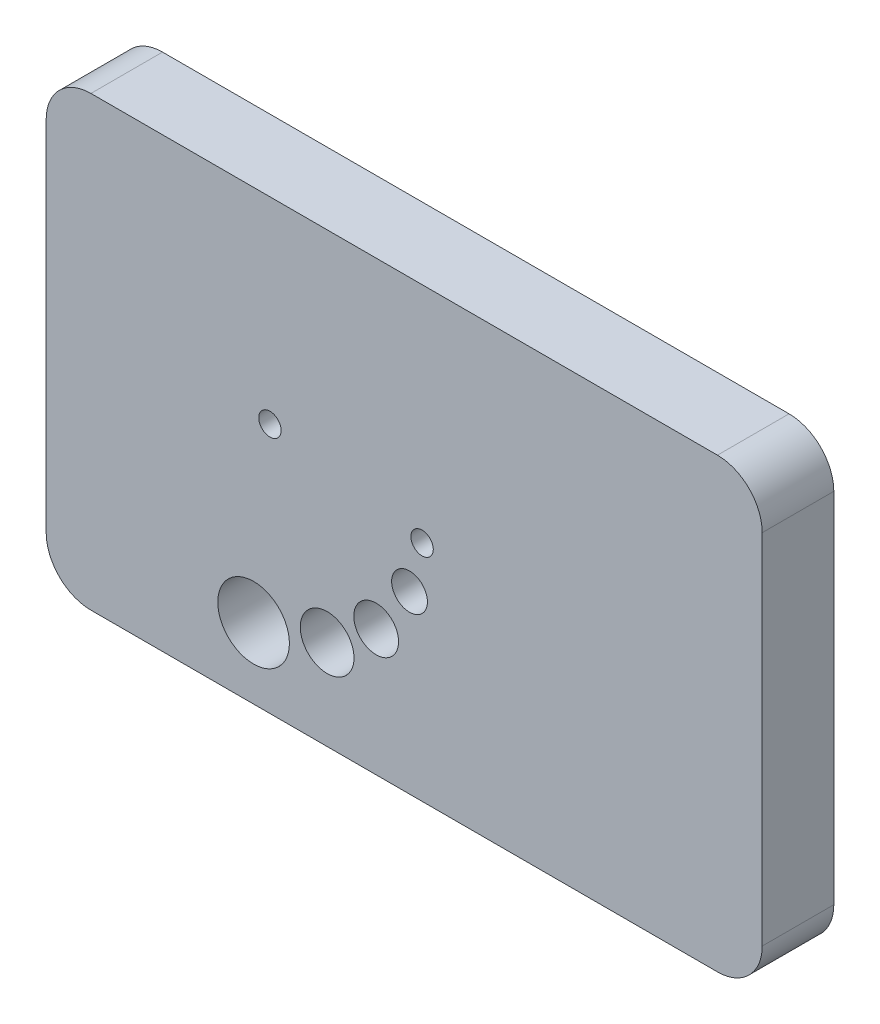
ISO-10303-21;
HEADER;
FILE_DESCRIPTION(('STEP AP214'),'2;1');
FILE_NAME('part.step','',(''),(''),'','','');
FILE_SCHEMA(('AUTOMOTIVE_DESIGN { 1 0 10303 214 1 1 1 1 }'));
ENDSEC;
DATA;
#1=APPLICATION_CONTEXT('core data for automotive mechanical design processes');
#2=APPLICATION_PROTOCOL_DEFINITION('international standard','automotive_design',2000,#1);
#3=PRODUCT_CONTEXT('',#1,'mechanical');
#4=PRODUCT('Part','Part','',(#3));
#5=PRODUCT_RELATED_PRODUCT_CATEGORY('part','',(#4));
#6=PRODUCT_DEFINITION_FORMATION('','',#4);
#7=PRODUCT_DEFINITION_CONTEXT('part definition',#1,'design');
#8=PRODUCT_DEFINITION('design','',#6,#7);
#9=PRODUCT_DEFINITION_SHAPE('','',#8);
#10=(LENGTH_UNIT() NAMED_UNIT(*) SI_UNIT(.MILLI.,.METRE.));
#11=(NAMED_UNIT(*) PLANE_ANGLE_UNIT() SI_UNIT($,.RADIAN.));
#12=(NAMED_UNIT(*) SI_UNIT($,.STERADIAN.) SOLID_ANGLE_UNIT());
#13=UNCERTAINTY_MEASURE_WITH_UNIT(LENGTH_MEASURE(1.E-05),#10,'distance_accuracy_value','');
#14=(GEOMETRIC_REPRESENTATION_CONTEXT(3) GLOBAL_UNCERTAINTY_ASSIGNED_CONTEXT((#13)) GLOBAL_UNIT_ASSIGNED_CONTEXT((#10,
#11,#12)) REPRESENTATION_CONTEXT('',''));
#15=CARTESIAN_POINT('',(0.,0.,0.));
#16=DIRECTION('',(0.,0.,1.));
#17=DIRECTION('',(1.,0.,0.));
#18=AXIS2_PLACEMENT_3D('',#15,#16,#17);
#19=CARTESIAN_POINT('',(0.,0.,8.));
#20=DIRECTION('',(0.,0.,-1.));
#21=DIRECTION('',(-1.,0.,0.));
#22=AXIS2_PLACEMENT_3D('',#19,#20,#21);
#23=PLANE('',#22);
#24=DIRECTION('',(-1.,0.,0.));
#25=VECTOR('',#24,1.);
#26=CARTESIAN_POINT('',(0.,50.,8.));
#27=LINE('',#26,#25);
#28=CARTESIAN_POINT('',(75.,50.,8.));
#29=VERTEX_POINT('',#28);
#30=CARTESIAN_POINT('',(5.,50.,8.));
#31=VERTEX_POINT('',#30);
#32=EDGE_CURVE('E136',#29,#31,#27,.T.);
#33=ORIENTED_EDGE('',*,*,#32,.T.);
#34=CARTESIAN_POINT('',(5.,45.,8.));
#35=DIRECTION('',(0.,0.,-1.));
#36=DIRECTION('',(-1.,0.,0.));
#37=AXIS2_PLACEMENT_3D('',#34,#35,#36);
#38=CIRCLE('',#37,5.);
#39=CARTESIAN_POINT('',(0.,45.,8.));
#40=VERTEX_POINT('',#39);
#41=EDGE_CURVE('E155',#31,#40,#38,.F.);
#42=ORIENTED_EDGE('',*,*,#41,.T.);
#43=DIRECTION('',(0.,-1.,0.));
#44=VECTOR('',#43,1.);
#45=CARTESIAN_POINT('',(0.,0.,8.));
#46=LINE('',#45,#44);
#47=CARTESIAN_POINT('',(0.,5.,8.));
#48=VERTEX_POINT('',#47);
#49=EDGE_CURVE('E119',#40,#48,#46,.T.);
#50=ORIENTED_EDGE('',*,*,#49,.T.);
#51=CARTESIAN_POINT('',(5.,5.,8.));
#52=DIRECTION('',(0.,0.,-1.));
#53=DIRECTION('',(-1.,0.,0.));
#54=AXIS2_PLACEMENT_3D('',#51,#52,#53);
#55=CIRCLE('',#54,5.);
#56=CARTESIAN_POINT('',(5.,0.,8.));
#57=VERTEX_POINT('',#56);
#58=EDGE_CURVE('E150',#48,#57,#55,.F.);
#59=ORIENTED_EDGE('',*,*,#58,.T.);
#60=DIRECTION('',(1.,0.,0.));
#61=VECTOR('',#60,1.);
#62=CARTESIAN_POINT('',(0.,0.,8.));
#63=LINE('',#62,#61);
#64=CARTESIAN_POINT('',(75.,0.,8.));
#65=VERTEX_POINT('',#64);
#66=EDGE_CURVE('E166',#57,#65,#63,.T.);
#67=ORIENTED_EDGE('',*,*,#66,.T.);
#68=CARTESIAN_POINT('',(75.,5.,8.));
#69=DIRECTION('',(0.,0.,-1.));
#70=DIRECTION('',(-1.,0.,0.));
#71=AXIS2_PLACEMENT_3D('',#68,#69,#70);
#72=CIRCLE('',#71,5.);
#73=CARTESIAN_POINT('',(80.,5.,8.));
#74=VERTEX_POINT('',#73);
#75=EDGE_CURVE('E55',#65,#74,#72,.F.);
#76=ORIENTED_EDGE('',*,*,#75,.T.);
#77=DIRECTION('',(0.,1.,0.));
#78=VECTOR('',#77,1.);
#79=CARTESIAN_POINT('',(80.,0.,8.));
#80=LINE('',#79,#78);
#81=CARTESIAN_POINT('',(80.,45.,8.));
#82=VERTEX_POINT('',#81);
#83=EDGE_CURVE('E174',#74,#82,#80,.T.);
#84=ORIENTED_EDGE('',*,*,#83,.T.);
#85=CARTESIAN_POINT('',(75.,45.,8.));
#86=DIRECTION('',(0.,0.,-1.));
#87=DIRECTION('',(-1.,0.,0.));
#88=AXIS2_PLACEMENT_3D('',#85,#86,#87);
#89=CIRCLE('',#88,5.);
#90=EDGE_CURVE('E153',#82,#29,#89,.F.);
#91=ORIENTED_EDGE('',*,*,#90,.T.);
#92=EDGE_LOOP('',(#33,#42,#50,#59,#67,#76,#84,#91));
#93=FACE_BOUND('',#92,.T.);
#94=CARTESIAN_POINT('',(25.,28.,8.));
#95=DIRECTION('',(0.,0.,1.));
#96=DIRECTION('',(1.,0.,0.));
#97=AXIS2_PLACEMENT_3D('',#94,#95,#96);
#98=CIRCLE('',#97,1.25);
#99=CARTESIAN_POINT('',(26.25,28.,8.));
#100=VERTEX_POINT('',#99);
#101=EDGE_CURVE('E127',#100,#100,#98,.T.);
#102=ORIENTED_EDGE('',*,*,#101,.F.);
#103=EDGE_LOOP('',(#102));
#104=FACE_BOUND('',#103,.T.);
#105=CARTESIAN_POINT('',(42.,25.,8.));
#106=DIRECTION('',(0.,0.,1.));
#107=DIRECTION('',(1.,0.,0.));
#108=AXIS2_PLACEMENT_3D('',#105,#106,#107);
#109=CIRCLE('',#108,1.25);
#110=CARTESIAN_POINT('',(43.25,25.,8.));
#111=VERTEX_POINT('',#110);
#112=EDGE_CURVE('E181',#111,#111,#109,.T.);
#113=ORIENTED_EDGE('',*,*,#112,.F.);
#114=EDGE_LOOP('',(#113));
#115=FACE_BOUND('',#114,.T.);
#116=CARTESIAN_POINT('',(40.5955116125583,19.598395279367,8.));
#117=DIRECTION('',(0.,0.,1.));
#118=DIRECTION('',(1.,0.,0.));
#119=AXIS2_PLACEMENT_3D('',#116,#117,#118);
#120=CIRCLE('',#119,2.);
#121=CARTESIAN_POINT('',(42.5955116125583,19.598395279367,8.));
#122=VERTEX_POINT('',#121);
#123=EDGE_CURVE('E186',#122,#122,#120,.T.);
#124=ORIENTED_EDGE('',*,*,#123,.F.);
#125=EDGE_LOOP('',(#124));
#126=FACE_BOUND('',#125,.T.);
#127=CARTESIAN_POINT('',(36.8701085414122,14.1198613512111,8.));
#128=DIRECTION('',(0.,0.,1.));
#129=DIRECTION('',(1.,0.,0.));
#130=AXIS2_PLACEMENT_3D('',#127,#128,#129);
#131=CIRCLE('',#130,2.5);
#132=CARTESIAN_POINT('',(39.3701085414122,14.1198613512111,8.));
#133=VERTEX_POINT('',#132);
#134=EDGE_CURVE('E192',#133,#133,#131,.T.);
#135=ORIENTED_EDGE('',*,*,#134,.F.);
#136=EDGE_LOOP('',(#135));
#137=FACE_BOUND('',#136,.T.);
#138=CARTESIAN_POINT('',(31.3915746132563,10.0657462443757,8.));
#139=DIRECTION('',(0.,0.,1.));
#140=DIRECTION('',(1.,0.,0.));
#141=AXIS2_PLACEMENT_3D('',#138,#139,#140);
#142=CIRCLE('',#141,3.);
#143=CARTESIAN_POINT('',(34.3915746132563,10.0657462443757,8.));
#144=VERTEX_POINT('',#143);
#145=EDGE_CURVE('E198',#144,#144,#142,.T.);
#146=ORIENTED_EDGE('',*,*,#145,.F.);
#147=EDGE_LOOP('',(#146));
#148=FACE_BOUND('',#147,.T.);
#149=CARTESIAN_POINT('',(23.1737737210224,7.87433267311331,8.));
#150=DIRECTION('',(0.,0.,1.));
#151=DIRECTION('',(1.,0.,0.));
#152=AXIS2_PLACEMENT_3D('',#149,#150,#151);
#153=CIRCLE('',#152,4.);
#154=CARTESIAN_POINT('',(27.1737737210224,7.87433267311331,8.));
#155=VERTEX_POINT('',#154);
#156=EDGE_CURVE('E204',#155,#155,#153,.T.);
#157=ORIENTED_EDGE('',*,*,#156,.F.);
#158=EDGE_LOOP('',(#157));
#159=FACE_BOUND('',#158,.T.);
#160=ADVANCED_FACE('F33',(#93,#104,#115,#126,#137,#148,#159),#23,.F.);
#161=CARTESIAN_POINT('',(0.,0.,0.));
#162=DIRECTION('',(0.,0.,-1.));
#163=DIRECTION('',(-1.,0.,0.));
#164=AXIS2_PLACEMENT_3D('',#161,#162,#163);
#165=PLANE('',#164);
#166=CARTESIAN_POINT('',(31.3915746132563,10.0657462443757,0.));
#167=DIRECTION('',(0.,0.,1.));
#168=DIRECTION('',(1.,0.,0.));
#169=AXIS2_PLACEMENT_3D('',#166,#167,#168);
#170=CIRCLE('',#169,3.);
#171=CARTESIAN_POINT('',(34.3915746132563,10.0657462443757,0.));
#172=VERTEX_POINT('',#171);
#173=EDGE_CURVE('E201',#172,#172,#170,.T.);
#174=ORIENTED_EDGE('',*,*,#173,.T.);
#175=EDGE_LOOP('',(#174));
#176=FACE_BOUND('',#175,.T.);
#177=CARTESIAN_POINT('',(40.5955116125583,19.598395279367,0.));
#178=DIRECTION('',(0.,0.,1.));
#179=DIRECTION('',(1.,0.,0.));
#180=AXIS2_PLACEMENT_3D('',#177,#178,#179);
#181=CIRCLE('',#180,2.);
#182=CARTESIAN_POINT('',(42.5955116125583,19.598395279367,0.));
#183=VERTEX_POINT('',#182);
#184=EDGE_CURVE('E189',#183,#183,#181,.T.);
#185=ORIENTED_EDGE('',*,*,#184,.T.);
#186=EDGE_LOOP('',(#185));
#187=FACE_BOUND('',#186,.T.);
#188=CARTESIAN_POINT('',(25.,28.,0.));
#189=DIRECTION('',(0.,0.,1.));
#190=DIRECTION('',(1.,0.,0.));
#191=AXIS2_PLACEMENT_3D('',#188,#189,#190);
#192=CIRCLE('',#191,1.25);
#193=CARTESIAN_POINT('',(26.25,28.,0.));
#194=VERTEX_POINT('',#193);
#195=EDGE_CURVE('E133',#194,#194,#192,.T.);
#196=ORIENTED_EDGE('',*,*,#195,.T.);
#197=EDGE_LOOP('',(#196));
#198=FACE_BOUND('',#197,.T.);
#199=DIRECTION('',(0.,-1.,0.));
#200=VECTOR('',#199,1.);
#201=CARTESIAN_POINT('',(0.,0.,0.));
#202=LINE('',#201,#200);
#203=CARTESIAN_POINT('',(0.,45.,0.));
#204=VERTEX_POINT('',#203);
#205=CARTESIAN_POINT('',(0.,5.,0.));
#206=VERTEX_POINT('',#205);
#207=EDGE_CURVE('E116',#204,#206,#202,.T.);
#208=ORIENTED_EDGE('',*,*,#207,.F.);
#209=CARTESIAN_POINT('',(5.,45.,0.));
#210=DIRECTION('',(0.,0.,-1.));
#211=DIRECTION('',(-1.,0.,0.));
#212=AXIS2_PLACEMENT_3D('',#209,#210,#211);
#213=CIRCLE('',#212,5.);
#214=CARTESIAN_POINT('',(5.,50.,0.));
#215=VERTEX_POINT('',#214);
#216=EDGE_CURVE('E99',#204,#215,#213,.T.);
#217=ORIENTED_EDGE('',*,*,#216,.T.);
#218=DIRECTION('',(-1.,0.,0.));
#219=VECTOR('',#218,1.);
#220=CARTESIAN_POINT('',(0.,50.,0.));
#221=LINE('',#220,#219);
#222=CARTESIAN_POINT('',(75.,50.,0.));
#223=VERTEX_POINT('',#222);
#224=EDGE_CURVE('E140',#223,#215,#221,.T.);
#225=ORIENTED_EDGE('',*,*,#224,.F.);
#226=CARTESIAN_POINT('',(75.,45.,0.));
#227=DIRECTION('',(0.,0.,-1.));
#228=DIRECTION('',(-1.,0.,0.));
#229=AXIS2_PLACEMENT_3D('',#226,#227,#228);
#230=CIRCLE('',#229,5.);
#231=CARTESIAN_POINT('',(80.,45.,0.));
#232=VERTEX_POINT('',#231);
#233=EDGE_CURVE('E110',#223,#232,#230,.T.);
#234=ORIENTED_EDGE('',*,*,#233,.T.);
#235=DIRECTION('',(0.,1.,0.));
#236=VECTOR('',#235,1.);
#237=CARTESIAN_POINT('',(80.,0.,0.));
#238=LINE('',#237,#236);
#239=CARTESIAN_POINT('',(80.,5.,0.));
#240=VERTEX_POINT('',#239);
#241=EDGE_CURVE('E130',#240,#232,#238,.T.);
#242=ORIENTED_EDGE('',*,*,#241,.F.);
#243=CARTESIAN_POINT('',(75.,5.,0.));
#244=DIRECTION('',(0.,0.,-1.));
#245=DIRECTION('',(-1.,0.,0.));
#246=AXIS2_PLACEMENT_3D('',#243,#244,#245);
#247=CIRCLE('',#246,5.);
#248=CARTESIAN_POINT('',(75.,0.,0.));
#249=VERTEX_POINT('',#248);
#250=EDGE_CURVE('E144',#240,#249,#247,.T.);
#251=ORIENTED_EDGE('',*,*,#250,.T.);
#252=DIRECTION('',(1.,0.,0.));
#253=VECTOR('',#252,1.);
#254=CARTESIAN_POINT('',(0.,0.,0.));
#255=LINE('',#254,#253);
#256=CARTESIAN_POINT('',(5.,0.,0.));
#257=VERTEX_POINT('',#256);
#258=EDGE_CURVE('E126',#257,#249,#255,.T.);
#259=ORIENTED_EDGE('',*,*,#258,.F.);
#260=CARTESIAN_POINT('',(5.,5.,0.));
#261=DIRECTION('',(0.,0.,-1.));
#262=DIRECTION('',(-1.,0.,0.));
#263=AXIS2_PLACEMENT_3D('',#260,#261,#262);
#264=CIRCLE('',#263,5.);
#265=EDGE_CURVE('E120',#257,#206,#264,.T.);
#266=ORIENTED_EDGE('',*,*,#265,.T.);
#267=EDGE_LOOP('',(#208,#217,#225,#234,#242,#251,#259,#266));
#268=FACE_BOUND('',#267,.T.);
#269=CARTESIAN_POINT('',(42.,25.,0.));
#270=DIRECTION('',(0.,0.,1.));
#271=DIRECTION('',(1.,0.,0.));
#272=AXIS2_PLACEMENT_3D('',#269,#270,#271);
#273=CIRCLE('',#272,1.25);
#274=CARTESIAN_POINT('',(43.25,25.,0.));
#275=VERTEX_POINT('',#274);
#276=EDGE_CURVE('E183',#275,#275,#273,.T.);
#277=ORIENTED_EDGE('',*,*,#276,.T.);
#278=EDGE_LOOP('',(#277));
#279=FACE_BOUND('',#278,.T.);
#280=CARTESIAN_POINT('',(36.8701085414122,14.1198613512111,0.));
#281=DIRECTION('',(0.,0.,1.));
#282=DIRECTION('',(1.,0.,0.));
#283=AXIS2_PLACEMENT_3D('',#280,#281,#282);
#284=CIRCLE('',#283,2.5);
#285=CARTESIAN_POINT('',(39.3701085414122,14.1198613512111,0.));
#286=VERTEX_POINT('',#285);
#287=EDGE_CURVE('E195',#286,#286,#284,.T.);
#288=ORIENTED_EDGE('',*,*,#287,.T.);
#289=EDGE_LOOP('',(#288));
#290=FACE_BOUND('',#289,.T.);
#291=CARTESIAN_POINT('',(23.1737737210224,7.87433267311331,0.));
#292=DIRECTION('',(0.,0.,1.));
#293=DIRECTION('',(1.,0.,0.));
#294=AXIS2_PLACEMENT_3D('',#291,#292,#293);
#295=CIRCLE('',#294,4.);
#296=CARTESIAN_POINT('',(27.1737737210224,7.87433267311331,0.));
#297=VERTEX_POINT('',#296);
#298=EDGE_CURVE('E207',#297,#297,#295,.T.);
#299=ORIENTED_EDGE('',*,*,#298,.T.);
#300=EDGE_LOOP('',(#299));
#301=FACE_BOUND('',#300,.T.);
#302=ADVANCED_FACE('F123',(#176,#187,#198,#268,#279,#290,#301),#165,.T.);
#303=CARTESIAN_POINT('',(0.,0.,8.));
#304=DIRECTION('',(1.,0.,0.));
#305=DIRECTION('',(0.,0.,-1.));
#306=AXIS2_PLACEMENT_3D('',#303,#304,#305);
#307=PLANE('',#306);
#308=ORIENTED_EDGE('',*,*,#49,.F.);
#309=DIRECTION('',(0.,0.,-1.));
#310=VECTOR('',#309,1.);
#311=CARTESIAN_POINT('',(0.,45.,8.));
#312=LINE('',#311,#310);
#313=EDGE_CURVE('E103',#40,#204,#312,.T.);
#314=ORIENTED_EDGE('',*,*,#313,.T.);
#315=ORIENTED_EDGE('',*,*,#207,.T.);
#316=DIRECTION('',(0.,0.,-1.));
#317=VECTOR('',#316,1.);
#318=CARTESIAN_POINT('',(0.,5.,8.));
#319=LINE('',#318,#317);
#320=EDGE_CURVE('E121',#206,#48,#319,.F.);
#321=ORIENTED_EDGE('',*,*,#320,.T.);
#322=EDGE_LOOP('',(#308,#314,#315,#321));
#323=FACE_BOUND('',#322,.T.);
#324=ADVANCED_FACE('F115',(#323),#307,.F.);
#325=CARTESIAN_POINT('',(0.,0.,8.));
#326=DIRECTION('',(0.,1.,0.));
#327=DIRECTION('',(0.,0.,1.));
#328=AXIS2_PLACEMENT_3D('',#325,#326,#327);
#329=PLANE('',#328);
#330=ORIENTED_EDGE('',*,*,#258,.T.);
#331=DIRECTION('',(0.,0.,-1.));
#332=VECTOR('',#331,1.);
#333=CARTESIAN_POINT('',(75.,0.,8.));
#334=LINE('',#333,#332);
#335=EDGE_CURVE('E11',#249,#65,#334,.F.);
#336=ORIENTED_EDGE('',*,*,#335,.T.);
#337=ORIENTED_EDGE('',*,*,#66,.F.);
#338=DIRECTION('',(0.,0.,-1.));
#339=VECTOR('',#338,1.);
#340=CARTESIAN_POINT('',(5.,0.,8.));
#341=LINE('',#340,#339);
#342=EDGE_CURVE('E41',#57,#257,#341,.T.);
#343=ORIENTED_EDGE('',*,*,#342,.T.);
#344=EDGE_LOOP('',(#330,#336,#337,#343));
#345=FACE_BOUND('',#344,.T.);
#346=ADVANCED_FACE('F164',(#345),#329,.F.);
#347=CARTESIAN_POINT('',(80.,0.,8.));
#348=DIRECTION('',(-1.,0.,0.));
#349=DIRECTION('',(0.,0.,1.));
#350=AXIS2_PLACEMENT_3D('',#347,#348,#349);
#351=PLANE('',#350);
#352=ORIENTED_EDGE('',*,*,#241,.T.);
#353=DIRECTION('',(0.,0.,-1.));
#354=VECTOR('',#353,1.);
#355=CARTESIAN_POINT('',(80.,45.,8.));
#356=LINE('',#355,#354);
#357=EDGE_CURVE('E48',#232,#82,#356,.F.);
#358=ORIENTED_EDGE('',*,*,#357,.T.);
#359=ORIENTED_EDGE('',*,*,#83,.F.);
#360=DIRECTION('',(0.,0.,-1.));
#361=VECTOR('',#360,1.);
#362=CARTESIAN_POINT('',(80.,5.,8.));
#363=LINE('',#362,#361);
#364=EDGE_CURVE('E157',#74,#240,#363,.T.);
#365=ORIENTED_EDGE('',*,*,#364,.T.);
#366=EDGE_LOOP('',(#352,#358,#359,#365));
#367=FACE_BOUND('',#366,.T.);
#368=ADVANCED_FACE('F173',(#367),#351,.F.);
#369=CARTESIAN_POINT('',(0.,50.,8.));
#370=DIRECTION('',(0.,-1.,0.));
#371=DIRECTION('',(0.,0.,-1.));
#372=AXIS2_PLACEMENT_3D('',#369,#370,#371);
#373=PLANE('',#372);
#374=ORIENTED_EDGE('',*,*,#224,.T.);
#375=DIRECTION('',(0.,0.,-1.));
#376=VECTOR('',#375,1.);
#377=CARTESIAN_POINT('',(5.,50.,8.));
#378=LINE('',#377,#376);
#379=EDGE_CURVE('E104',#215,#31,#378,.F.);
#380=ORIENTED_EDGE('',*,*,#379,.T.);
#381=ORIENTED_EDGE('',*,*,#32,.F.);
#382=DIRECTION('',(0.,0.,-1.));
#383=VECTOR('',#382,1.);
#384=CARTESIAN_POINT('',(75.,50.,8.));
#385=LINE('',#384,#383);
#386=EDGE_CURVE('E109',#29,#223,#385,.T.);
#387=ORIENTED_EDGE('',*,*,#386,.T.);
#388=EDGE_LOOP('',(#374,#380,#381,#387));
#389=FACE_BOUND('',#388,.T.);
#390=ADVANCED_FACE('F228',(#389),#373,.F.);
#391=CARTESIAN_POINT('',(25.,28.,8.));
#392=DIRECTION('',(0.,0.,-1.));
#393=DIRECTION('',(-1.,0.,0.));
#394=AXIS2_PLACEMENT_3D('',#391,#392,#393);
#395=CYLINDRICAL_SURFACE('',#394,1.25);
#396=ORIENTED_EDGE('',*,*,#101,.T.);
#397=EDGE_LOOP('',(#396));
#398=FACE_BOUND('',#397,.T.);
#399=ORIENTED_EDGE('',*,*,#195,.F.);
#400=EDGE_LOOP('',(#399));
#401=FACE_BOUND('',#400,.T.);
#402=ADVANCED_FACE('F225',(#398,#401),#395,.F.);
#403=CARTESIAN_POINT('',(42.,25.,8.));
#404=DIRECTION('',(0.,0.,-1.));
#405=DIRECTION('',(-1.,0.,0.));
#406=AXIS2_PLACEMENT_3D('',#403,#404,#405);
#407=CYLINDRICAL_SURFACE('',#406,1.25);
#408=ORIENTED_EDGE('',*,*,#112,.T.);
#409=EDGE_LOOP('',(#408));
#410=FACE_BOUND('',#409,.T.);
#411=ORIENTED_EDGE('',*,*,#276,.F.);
#412=EDGE_LOOP('',(#411));
#413=FACE_BOUND('',#412,.T.);
#414=ADVANCED_FACE('F341',(#410,#413),#407,.F.);
#415=CARTESIAN_POINT('',(40.5955116125583,19.598395279367,8.));
#416=DIRECTION('',(0.,0.,-1.));
#417=DIRECTION('',(-1.,0.,0.));
#418=AXIS2_PLACEMENT_3D('',#415,#416,#417);
#419=CYLINDRICAL_SURFACE('',#418,2.);
#420=ORIENTED_EDGE('',*,*,#123,.T.);
#421=EDGE_LOOP('',(#420));
#422=FACE_BOUND('',#421,.T.);
#423=ORIENTED_EDGE('',*,*,#184,.F.);
#424=EDGE_LOOP('',(#423));
#425=FACE_BOUND('',#424,.T.);
#426=ADVANCED_FACE('F331',(#422,#425),#419,.F.);
#427=CARTESIAN_POINT('',(36.8701085414122,14.1198613512111,8.));
#428=DIRECTION('',(0.,0.,-1.));
#429=DIRECTION('',(-1.,0.,0.));
#430=AXIS2_PLACEMENT_3D('',#427,#428,#429);
#431=CYLINDRICAL_SURFACE('',#430,2.5);
#432=ORIENTED_EDGE('',*,*,#134,.T.);
#433=EDGE_LOOP('',(#432));
#434=FACE_BOUND('',#433,.T.);
#435=ORIENTED_EDGE('',*,*,#287,.F.);
#436=EDGE_LOOP('',(#435));
#437=FACE_BOUND('',#436,.T.);
#438=ADVANCED_FACE('F321',(#434,#437),#431,.F.);
#439=CARTESIAN_POINT('',(31.3915746132563,10.0657462443757,8.));
#440=DIRECTION('',(0.,0.,-1.));
#441=DIRECTION('',(-1.,0.,0.));
#442=AXIS2_PLACEMENT_3D('',#439,#440,#441);
#443=CYLINDRICAL_SURFACE('',#442,3.);
#444=ORIENTED_EDGE('',*,*,#145,.T.);
#445=EDGE_LOOP('',(#444));
#446=FACE_BOUND('',#445,.T.);
#447=ORIENTED_EDGE('',*,*,#173,.F.);
#448=EDGE_LOOP('',(#447));
#449=FACE_BOUND('',#448,.T.);
#450=ADVANCED_FACE('F312',(#446,#449),#443,.F.);
#451=CARTESIAN_POINT('',(23.1737737210224,7.87433267311331,8.));
#452=DIRECTION('',(0.,0.,-1.));
#453=DIRECTION('',(-1.,0.,0.));
#454=AXIS2_PLACEMENT_3D('',#451,#452,#453);
#455=CYLINDRICAL_SURFACE('',#454,4.);
#456=ORIENTED_EDGE('',*,*,#156,.T.);
#457=EDGE_LOOP('',(#456));
#458=FACE_BOUND('',#457,.T.);
#459=ORIENTED_EDGE('',*,*,#298,.F.);
#460=EDGE_LOOP('',(#459));
#461=FACE_BOUND('',#460,.T.);
#462=ADVANCED_FACE('F213',(#458,#461),#455,.F.);
#463=CARTESIAN_POINT('',(5.,45.,8.));
#464=DIRECTION('',(0.,0.,-1.));
#465=DIRECTION('',(-1.,0.,0.));
#466=AXIS2_PLACEMENT_3D('',#463,#464,#465);
#467=CYLINDRICAL_SURFACE('',#466,5.);
#468=ORIENTED_EDGE('',*,*,#41,.F.);
#469=ORIENTED_EDGE('',*,*,#379,.F.);
#470=ORIENTED_EDGE('',*,*,#216,.F.);
#471=ORIENTED_EDGE('',*,*,#313,.F.);
#472=EDGE_LOOP('',(#468,#469,#470,#471));
#473=FACE_BOUND('',#472,.T.);
#474=ADVANCED_FACE('F102',(#473),#467,.T.);
#475=CARTESIAN_POINT('',(75.,45.,8.));
#476=DIRECTION('',(0.,0.,-1.));
#477=DIRECTION('',(-1.,0.,0.));
#478=AXIS2_PLACEMENT_3D('',#475,#476,#477);
#479=CYLINDRICAL_SURFACE('',#478,5.);
#480=ORIENTED_EDGE('',*,*,#90,.F.);
#481=ORIENTED_EDGE('',*,*,#357,.F.);
#482=ORIENTED_EDGE('',*,*,#233,.F.);
#483=ORIENTED_EDGE('',*,*,#386,.F.);
#484=EDGE_LOOP('',(#480,#481,#482,#483));
#485=FACE_BOUND('',#484,.T.);
#486=ADVANCED_FACE('F240',(#485),#479,.T.);
#487=CARTESIAN_POINT('',(75.,5.,8.));
#488=DIRECTION('',(0.,0.,-1.));
#489=DIRECTION('',(-1.,0.,0.));
#490=AXIS2_PLACEMENT_3D('',#487,#488,#489);
#491=CYLINDRICAL_SURFACE('',#490,5.);
#492=ORIENTED_EDGE('',*,*,#75,.F.);
#493=ORIENTED_EDGE('',*,*,#335,.F.);
#494=ORIENTED_EDGE('',*,*,#250,.F.);
#495=ORIENTED_EDGE('',*,*,#364,.F.);
#496=EDGE_LOOP('',(#492,#493,#494,#495));
#497=FACE_BOUND('',#496,.T.);
#498=ADVANCED_FACE('F172',(#497),#491,.T.);
#499=CARTESIAN_POINT('',(5.,5.,8.));
#500=DIRECTION('',(0.,0.,-1.));
#501=DIRECTION('',(-1.,0.,0.));
#502=AXIS2_PLACEMENT_3D('',#499,#500,#501);
#503=CYLINDRICAL_SURFACE('',#502,5.);
#504=ORIENTED_EDGE('',*,*,#58,.F.);
#505=ORIENTED_EDGE('',*,*,#320,.F.);
#506=ORIENTED_EDGE('',*,*,#265,.F.);
#507=ORIENTED_EDGE('',*,*,#342,.F.);
#508=EDGE_LOOP('',(#504,#505,#506,#507));
#509=FACE_BOUND('',#508,.T.);
#510=ADVANCED_FACE('F35',(#509),#503,.T.);
#511=CLOSED_SHELL('',(#160,#302,#324,#346,#368,#390,#402,#414,#426,#438,#450,#462,#474,#486,
#498,#510));
#512=MANIFOLD_SOLID_BREP('B2',#511);
#513=ADVANCED_BREP_SHAPE_REPRESENTATION('',(#18,#512),#14);
#514=SHAPE_DEFINITION_REPRESENTATION(#9,#513);
ENDSEC;
END-ISO-10303-21;
